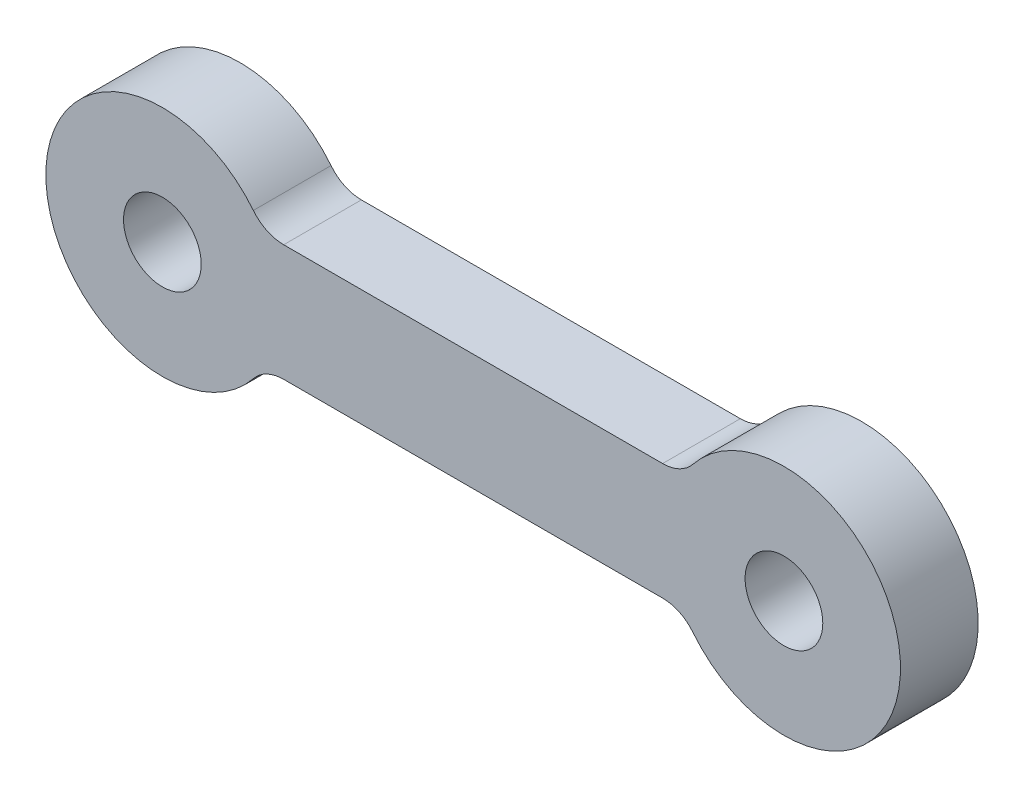
ISO-10303-21;
HEADER;
FILE_DESCRIPTION(('STEP AP214'),'2;1');
FILE_NAME('part.step','',(''),(''),'','','');
FILE_SCHEMA(('AUTOMOTIVE_DESIGN { 1 0 10303 214 1 1 1 1 }'));
ENDSEC;
DATA;
#1=APPLICATION_CONTEXT('core data for automotive mechanical design processes');
#2=APPLICATION_PROTOCOL_DEFINITION('international standard','automotive_design',2000,#1);
#3=PRODUCT_CONTEXT('',#1,'mechanical');
#4=PRODUCT('Part','Part','',(#3));
#5=PRODUCT_RELATED_PRODUCT_CATEGORY('part','',(#4));
#6=PRODUCT_DEFINITION_FORMATION('','',#4);
#7=PRODUCT_DEFINITION_CONTEXT('part definition',#1,'design');
#8=PRODUCT_DEFINITION('design','',#6,#7);
#9=PRODUCT_DEFINITION_SHAPE('','',#8);
#10=(LENGTH_UNIT() NAMED_UNIT(*) SI_UNIT(.MILLI.,.METRE.));
#11=(NAMED_UNIT(*) PLANE_ANGLE_UNIT() SI_UNIT($,.RADIAN.));
#12=(NAMED_UNIT(*) SI_UNIT($,.STERADIAN.) SOLID_ANGLE_UNIT());
#13=UNCERTAINTY_MEASURE_WITH_UNIT(LENGTH_MEASURE(1.E-05),#10,'distance_accuracy_value','');
#14=(GEOMETRIC_REPRESENTATION_CONTEXT(3) GLOBAL_UNCERTAINTY_ASSIGNED_CONTEXT((#13)) GLOBAL_UNIT_ASSIGNED_CONTEXT((#10,
#11,#12)) REPRESENTATION_CONTEXT('',''));
#15=CARTESIAN_POINT('',(0.,0.,0.));
#16=DIRECTION('',(0.,0.,1.));
#17=DIRECTION('',(1.,0.,0.));
#18=AXIS2_PLACEMENT_3D('',#15,#16,#17);
#19=CARTESIAN_POINT('',(-101.6,0.,12.7));
#20=DIRECTION('',(0.,0.,1.));
#21=DIRECTION('',(1.,0.,0.));
#22=AXIS2_PLACEMENT_3D('',#19,#20,#21);
#23=PLANE('',#22);
#24=CARTESIAN_POINT('',(0.,0.,12.7));
#25=DIRECTION('',(0.,0.,1.));
#26=DIRECTION('',(1.,0.,0.));
#27=AXIS2_PLACEMENT_3D('',#24,#25,#26);
#28=CIRCLE('',#27,6.35);
#29=CARTESIAN_POINT('',(6.35,0.,12.7));
#30=VERTEX_POINT('',#29);
#31=EDGE_CURVE('E183',#30,#30,#28,.T.);
#32=ORIENTED_EDGE('',*,*,#31,.F.);
#33=EDGE_LOOP('',(#32));
#34=FACE_BOUND('',#33,.T.);
#35=DIRECTION('',(-1.,0.,0.));
#36=VECTOR('',#35,1.);
#37=CARTESIAN_POINT('',(-85.1022160579064,9.525,12.7));
#38=LINE('',#37,#36);
#39=CARTESIAN_POINT('',(-19.8278686449149,9.525,12.7));
#40=VERTEX_POINT('',#39);
#41=CARTESIAN_POINT('',(-81.7721313550851,9.525,12.7));
#42=VERTEX_POINT('',#41);
#43=EDGE_CURVE('E142',#40,#42,#38,.T.);
#44=ORIENTED_EDGE('',*,*,#43,.T.);
#45=CARTESIAN_POINT('',(-81.7721313550851,15.875,12.7));
#46=DIRECTION('',(0.,0.,1.));
#47=DIRECTION('',(1.,0.,0.));
#48=AXIS2_PLACEMENT_3D('',#45,#46,#47);
#49=CIRCLE('',#48,6.35);
#50=CARTESIAN_POINT('',(-86.7290985163138,11.90625,12.7));
#51=VERTEX_POINT('',#50);
#52=EDGE_CURVE('E11',#42,#51,#49,.F.);
#53=ORIENTED_EDGE('',*,*,#52,.T.);
#54=CARTESIAN_POINT('',(-101.6,0.,12.7));
#55=DIRECTION('',(0.,0.,1.));
#56=DIRECTION('',(1.,0.,0.));
#57=AXIS2_PLACEMENT_3D('',#54,#55,#56);
#58=CIRCLE('',#57,19.05);
#59=CARTESIAN_POINT('',(-86.7290985163138,-11.90625,12.7));
#60=VERTEX_POINT('',#59);
#61=EDGE_CURVE('E136',#51,#60,#58,.T.);
#62=ORIENTED_EDGE('',*,*,#61,.T.);
#63=CARTESIAN_POINT('',(-81.7721313550851,-15.875,12.7));
#64=DIRECTION('',(0.,0.,1.));
#65=DIRECTION('',(1.,0.,0.));
#66=AXIS2_PLACEMENT_3D('',#63,#64,#65);
#67=CIRCLE('',#66,6.35);
#68=CARTESIAN_POINT('',(-81.7721313550851,-9.525,12.7));
#69=VERTEX_POINT('',#68);
#70=EDGE_CURVE('E158',#60,#69,#67,.F.);
#71=ORIENTED_EDGE('',*,*,#70,.T.);
#72=DIRECTION('',(1.,0.,0.));
#73=VECTOR('',#72,1.);
#74=CARTESIAN_POINT('',(-85.1022160579064,-9.525,12.7));
#75=LINE('',#74,#73);
#76=CARTESIAN_POINT('',(-19.8278686449149,-9.525,12.7));
#77=VERTEX_POINT('',#76);
#78=EDGE_CURVE('E174',#69,#77,#75,.T.);
#79=ORIENTED_EDGE('',*,*,#78,.T.);
#80=CARTESIAN_POINT('',(-19.8278686449149,-15.875,12.7));
#81=DIRECTION('',(0.,0.,1.));
#82=DIRECTION('',(1.,0.,0.));
#83=AXIS2_PLACEMENT_3D('',#80,#81,#82);
#84=CIRCLE('',#83,6.35);
#85=CARTESIAN_POINT('',(-14.8709014836862,-11.90625,12.7));
#86=VERTEX_POINT('',#85);
#87=EDGE_CURVE('E115',#77,#86,#84,.F.);
#88=ORIENTED_EDGE('',*,*,#87,.T.);
#89=CARTESIAN_POINT('',(0.,0.,12.7));
#90=DIRECTION('',(0.,0.,1.));
#91=DIRECTION('',(1.,0.,0.));
#92=AXIS2_PLACEMENT_3D('',#89,#90,#91);
#93=CIRCLE('',#92,19.05);
#94=CARTESIAN_POINT('',(-14.8709014836862,11.90625,12.7));
#95=VERTEX_POINT('',#94);
#96=EDGE_CURVE('E124',#86,#95,#93,.T.);
#97=ORIENTED_EDGE('',*,*,#96,.T.);
#98=CARTESIAN_POINT('',(-19.8278686449149,15.875,12.7));
#99=DIRECTION('',(0.,0.,1.));
#100=DIRECTION('',(1.,0.,0.));
#101=AXIS2_PLACEMENT_3D('',#98,#99,#100);
#102=CIRCLE('',#101,6.35);
#103=EDGE_CURVE('E61',#95,#40,#102,.F.);
#104=ORIENTED_EDGE('',*,*,#103,.T.);
#105=EDGE_LOOP('',(#44,#53,#62,#71,#79,#88,#97,#104));
#106=FACE_BOUND('',#105,.T.);
#107=CARTESIAN_POINT('',(-101.6,0.,12.7));
#108=DIRECTION('',(0.,0.,1.));
#109=DIRECTION('',(1.,0.,0.));
#110=AXIS2_PLACEMENT_3D('',#107,#108,#109);
#111=CIRCLE('',#110,6.35);
#112=CARTESIAN_POINT('',(-95.25,0.,12.7));
#113=VERTEX_POINT('',#112);
#114=EDGE_CURVE('E188',#113,#113,#111,.T.);
#115=ORIENTED_EDGE('',*,*,#114,.F.);
#116=EDGE_LOOP('',(#115));
#117=FACE_BOUND('',#116,.T.);
#118=ADVANCED_FACE('F39',(#34,#106,#117),#23,.T.);
#119=CARTESIAN_POINT('',(-101.6,0.,0.));
#120=DIRECTION('',(0.,0.,1.));
#121=DIRECTION('',(1.,0.,0.));
#122=AXIS2_PLACEMENT_3D('',#119,#120,#121);
#123=PLANE('',#122);
#124=CARTESIAN_POINT('',(-101.6,0.,0.));
#125=DIRECTION('',(0.,0.,1.));
#126=DIRECTION('',(1.,0.,0.));
#127=AXIS2_PLACEMENT_3D('',#124,#125,#126);
#128=CIRCLE('',#127,19.05);
#129=CARTESIAN_POINT('',(-86.7290985163138,11.90625,0.));
#130=VERTEX_POINT('',#129);
#131=CARTESIAN_POINT('',(-86.7290985163138,-11.90625,0.));
#132=VERTEX_POINT('',#131);
#133=EDGE_CURVE('E138',#130,#132,#128,.T.);
#134=ORIENTED_EDGE('',*,*,#133,.F.);
#135=CARTESIAN_POINT('',(-81.7721313550851,15.875,0.));
#136=DIRECTION('',(0.,0.,1.));
#137=DIRECTION('',(1.,0.,0.));
#138=AXIS2_PLACEMENT_3D('',#135,#136,#137);
#139=CIRCLE('',#138,6.35);
#140=CARTESIAN_POINT('',(-81.7721313550851,9.525,0.));
#141=VERTEX_POINT('',#140);
#142=EDGE_CURVE('E47',#130,#141,#139,.T.);
#143=ORIENTED_EDGE('',*,*,#142,.T.);
#144=DIRECTION('',(-1.,0.,0.));
#145=VECTOR('',#144,1.);
#146=CARTESIAN_POINT('',(-85.1022160579064,9.525,0.));
#147=LINE('',#146,#145);
#148=CARTESIAN_POINT('',(-19.8278686449149,9.525,0.));
#149=VERTEX_POINT('',#148);
#150=EDGE_CURVE('E133',#149,#141,#147,.T.);
#151=ORIENTED_EDGE('',*,*,#150,.F.);
#152=CARTESIAN_POINT('',(-19.8278686449149,15.875,0.));
#153=DIRECTION('',(0.,0.,1.));
#154=DIRECTION('',(1.,0.,0.));
#155=AXIS2_PLACEMENT_3D('',#152,#153,#154);
#156=CIRCLE('',#155,6.35);
#157=CARTESIAN_POINT('',(-14.8709014836862,11.90625,0.));
#158=VERTEX_POINT('',#157);
#159=EDGE_CURVE('E132',#149,#158,#156,.T.);
#160=ORIENTED_EDGE('',*,*,#159,.T.);
#161=CARTESIAN_POINT('',(0.,0.,0.));
#162=DIRECTION('',(0.,0.,1.));
#163=DIRECTION('',(1.,0.,0.));
#164=AXIS2_PLACEMENT_3D('',#161,#162,#163);
#165=CIRCLE('',#164,19.05);
#166=CARTESIAN_POINT('',(-14.8709014836862,-11.90625,0.));
#167=VERTEX_POINT('',#166);
#168=EDGE_CURVE('E122',#167,#158,#165,.T.);
#169=ORIENTED_EDGE('',*,*,#168,.F.);
#170=CARTESIAN_POINT('',(-19.8278686449149,-15.875,0.));
#171=DIRECTION('',(0.,0.,1.));
#172=DIRECTION('',(1.,0.,0.));
#173=AXIS2_PLACEMENT_3D('',#170,#171,#172);
#174=CIRCLE('',#173,6.35);
#175=CARTESIAN_POINT('',(-19.8278686449149,-9.525,0.));
#176=VERTEX_POINT('',#175);
#177=EDGE_CURVE('E105',#167,#176,#174,.T.);
#178=ORIENTED_EDGE('',*,*,#177,.T.);
#179=DIRECTION('',(1.,0.,0.));
#180=VECTOR('',#179,1.);
#181=CARTESIAN_POINT('',(-85.1022160579064,-9.525,0.));
#182=LINE('',#181,#180);
#183=CARTESIAN_POINT('',(-81.7721313550851,-9.525,0.));
#184=VERTEX_POINT('',#183);
#185=EDGE_CURVE('E134',#184,#176,#182,.T.);
#186=ORIENTED_EDGE('',*,*,#185,.F.);
#187=CARTESIAN_POINT('',(-81.7721313550851,-15.875,0.));
#188=DIRECTION('',(0.,0.,1.));
#189=DIRECTION('',(1.,0.,0.));
#190=AXIS2_PLACEMENT_3D('',#187,#188,#189);
#191=CIRCLE('',#190,6.35);
#192=EDGE_CURVE('E156',#184,#132,#191,.T.);
#193=ORIENTED_EDGE('',*,*,#192,.T.);
#194=EDGE_LOOP('',(#134,#143,#151,#160,#169,#178,#186,#193));
#195=FACE_BOUND('',#194,.T.);
#196=CARTESIAN_POINT('',(0.,0.,0.));
#197=DIRECTION('',(0.,0.,1.));
#198=DIRECTION('',(1.,0.,0.));
#199=AXIS2_PLACEMENT_3D('',#196,#197,#198);
#200=CIRCLE('',#199,6.35);
#201=CARTESIAN_POINT('',(6.35,0.,0.));
#202=VERTEX_POINT('',#201);
#203=EDGE_CURVE('E179',#202,#202,#200,.T.);
#204=ORIENTED_EDGE('',*,*,#203,.T.);
#205=EDGE_LOOP('',(#204));
#206=FACE_BOUND('',#205,.T.);
#207=CARTESIAN_POINT('',(-101.6,0.,0.));
#208=DIRECTION('',(0.,0.,1.));
#209=DIRECTION('',(1.,0.,0.));
#210=AXIS2_PLACEMENT_3D('',#207,#208,#209);
#211=CIRCLE('',#210,6.35);
#212=CARTESIAN_POINT('',(-95.25,0.,0.));
#213=VERTEX_POINT('',#212);
#214=EDGE_CURVE('E190',#213,#213,#211,.T.);
#215=ORIENTED_EDGE('',*,*,#214,.T.);
#216=EDGE_LOOP('',(#215));
#217=FACE_BOUND('',#216,.T.);
#218=ADVANCED_FACE('F129',(#195,#206,#217),#123,.F.);
#219=CARTESIAN_POINT('',(-101.6,0.,12.7));
#220=DIRECTION('',(0.,0.,-1.));
#221=DIRECTION('',(-1.,0.,0.));
#222=AXIS2_PLACEMENT_3D('',#219,#220,#221);
#223=CYLINDRICAL_SURFACE('',#222,19.05);
#224=ORIENTED_EDGE('',*,*,#133,.T.);
#225=DIRECTION('',(0.,0.,-1.));
#226=VECTOR('',#225,1.);
#227=CARTESIAN_POINT('',(-86.7290985163138,-11.90625,12.7));
#228=LINE('',#227,#226);
#229=EDGE_CURVE('E150',#132,#60,#228,.F.);
#230=ORIENTED_EDGE('',*,*,#229,.T.);
#231=ORIENTED_EDGE('',*,*,#61,.F.);
#232=DIRECTION('',(0.,0.,-1.));
#233=VECTOR('',#232,1.);
#234=CARTESIAN_POINT('',(-86.7290985163138,11.90625,12.7));
#235=LINE('',#234,#233);
#236=EDGE_CURVE('E147',#51,#130,#235,.T.);
#237=ORIENTED_EDGE('',*,*,#236,.T.);
#238=EDGE_LOOP('',(#224,#230,#231,#237));
#239=FACE_BOUND('',#238,.T.);
#240=ADVANCED_FACE('F172',(#239),#223,.T.);
#241=CARTESIAN_POINT('',(-85.1022160579064,-9.525,12.7));
#242=DIRECTION('',(0.,1.,0.));
#243=DIRECTION('',(0.,0.,1.));
#244=AXIS2_PLACEMENT_3D('',#241,#242,#243);
#245=PLANE('',#244);
#246=ORIENTED_EDGE('',*,*,#185,.T.);
#247=DIRECTION('',(0.,0.,1.));
#248=VECTOR('',#247,1.);
#249=CARTESIAN_POINT('',(-19.8278686449149,-9.525,12.7));
#250=LINE('',#249,#248);
#251=EDGE_CURVE('E110',#176,#77,#250,.T.);
#252=ORIENTED_EDGE('',*,*,#251,.T.);
#253=ORIENTED_EDGE('',*,*,#78,.F.);
#254=DIRECTION('',(0.,0.,1.));
#255=VECTOR('',#254,1.);
#256=CARTESIAN_POINT('',(-81.7721313550851,-9.525,0.));
#257=LINE('',#256,#255);
#258=EDGE_CURVE('E125',#69,#184,#257,.F.);
#259=ORIENTED_EDGE('',*,*,#258,.T.);
#260=EDGE_LOOP('',(#246,#252,#253,#259));
#261=FACE_BOUND('',#260,.T.);
#262=ADVANCED_FACE('F214',(#261),#245,.F.);
#263=CARTESIAN_POINT('',(0.,0.,12.7));
#264=DIRECTION('',(0.,0.,-1.));
#265=DIRECTION('',(-1.,0.,0.));
#266=AXIS2_PLACEMENT_3D('',#263,#264,#265);
#267=CYLINDRICAL_SURFACE('',#266,19.05);
#268=ORIENTED_EDGE('',*,*,#96,.F.);
#269=DIRECTION('',(0.,0.,-1.));
#270=VECTOR('',#269,1.);
#271=CARTESIAN_POINT('',(-14.8709014836862,-11.90625,12.7));
#272=LINE('',#271,#270);
#273=EDGE_CURVE('E109',#86,#167,#272,.T.);
#274=ORIENTED_EDGE('',*,*,#273,.T.);
#275=ORIENTED_EDGE('',*,*,#168,.T.);
#276=DIRECTION('',(0.,0.,-1.));
#277=VECTOR('',#276,1.);
#278=CARTESIAN_POINT('',(-14.8709014836862,11.90625,12.7));
#279=LINE('',#278,#277);
#280=EDGE_CURVE('E126',#158,#95,#279,.F.);
#281=ORIENTED_EDGE('',*,*,#280,.T.);
#282=EDGE_LOOP('',(#268,#274,#275,#281));
#283=FACE_BOUND('',#282,.T.);
#284=ADVANCED_FACE('F121',(#283),#267,.T.);
#285=CARTESIAN_POINT('',(-85.1022160579064,9.525,12.7));
#286=DIRECTION('',(0.,-1.,0.));
#287=DIRECTION('',(0.,0.,-1.));
#288=AXIS2_PLACEMENT_3D('',#285,#286,#287);
#289=PLANE('',#288);
#290=ORIENTED_EDGE('',*,*,#43,.F.);
#291=DIRECTION('',(0.,0.,1.));
#292=VECTOR('',#291,1.);
#293=CARTESIAN_POINT('',(-19.8278686449149,9.525,0.));
#294=LINE('',#293,#292);
#295=EDGE_CURVE('E116',#40,#149,#294,.F.);
#296=ORIENTED_EDGE('',*,*,#295,.T.);
#297=ORIENTED_EDGE('',*,*,#150,.T.);
#298=DIRECTION('',(0.,0.,1.));
#299=VECTOR('',#298,1.);
#300=CARTESIAN_POINT('',(-81.7721313550851,9.525,12.7));
#301=LINE('',#300,#299);
#302=EDGE_CURVE('E54',#141,#42,#301,.T.);
#303=ORIENTED_EDGE('',*,*,#302,.T.);
#304=EDGE_LOOP('',(#290,#296,#297,#303));
#305=FACE_BOUND('',#304,.T.);
#306=ADVANCED_FACE('F164',(#305),#289,.F.);
#307=CARTESIAN_POINT('',(0.,0.,12.7));
#308=DIRECTION('',(0.,0.,-1.));
#309=DIRECTION('',(-1.,0.,0.));
#310=AXIS2_PLACEMENT_3D('',#307,#308,#309);
#311=CYLINDRICAL_SURFACE('',#310,6.35);
#312=ORIENTED_EDGE('',*,*,#31,.T.);
#313=EDGE_LOOP('',(#312));
#314=FACE_BOUND('',#313,.T.);
#315=ORIENTED_EDGE('',*,*,#203,.F.);
#316=EDGE_LOOP('',(#315));
#317=FACE_BOUND('',#316,.T.);
#318=ADVANCED_FACE('F207',(#314,#317),#311,.F.);
#319=CARTESIAN_POINT('',(-101.6,0.,12.7));
#320=DIRECTION('',(0.,0.,-1.));
#321=DIRECTION('',(-1.,0.,0.));
#322=AXIS2_PLACEMENT_3D('',#319,#320,#321);
#323=CYLINDRICAL_SURFACE('',#322,6.35);
#324=ORIENTED_EDGE('',*,*,#114,.T.);
#325=EDGE_LOOP('',(#324));
#326=FACE_BOUND('',#325,.T.);
#327=ORIENTED_EDGE('',*,*,#214,.F.);
#328=EDGE_LOOP('',(#327));
#329=FACE_BOUND('',#328,.T.);
#330=ADVANCED_FACE('F196',(#326,#329),#323,.F.);
#331=CARTESIAN_POINT('',(-19.8278686449149,-15.875,12.7));
#332=DIRECTION('',(0.,0.,-1.));
#333=DIRECTION('',(-1.,0.,0.));
#334=AXIS2_PLACEMENT_3D('',#331,#332,#333);
#335=CYLINDRICAL_SURFACE('',#334,6.35);
#336=ORIENTED_EDGE('',*,*,#87,.F.);
#337=ORIENTED_EDGE('',*,*,#251,.F.);
#338=ORIENTED_EDGE('',*,*,#177,.F.);
#339=ORIENTED_EDGE('',*,*,#273,.F.);
#340=EDGE_LOOP('',(#336,#337,#338,#339));
#341=FACE_BOUND('',#340,.T.);
#342=ADVANCED_FACE('F108',(#341),#335,.F.);
#343=CARTESIAN_POINT('',(-81.7721313550851,-15.875,12.7));
#344=DIRECTION('',(0.,0.,-1.));
#345=DIRECTION('',(-1.,0.,0.));
#346=AXIS2_PLACEMENT_3D('',#343,#344,#345);
#347=CYLINDRICAL_SURFACE('',#346,6.35);
#348=ORIENTED_EDGE('',*,*,#70,.F.);
#349=ORIENTED_EDGE('',*,*,#229,.F.);
#350=ORIENTED_EDGE('',*,*,#192,.F.);
#351=ORIENTED_EDGE('',*,*,#258,.F.);
#352=EDGE_LOOP('',(#348,#349,#350,#351));
#353=FACE_BOUND('',#352,.T.);
#354=ADVANCED_FACE('F222',(#353),#347,.F.);
#355=CARTESIAN_POINT('',(-19.8278686449149,15.875,12.7));
#356=DIRECTION('',(0.,0.,-1.));
#357=DIRECTION('',(-1.,0.,0.));
#358=AXIS2_PLACEMENT_3D('',#355,#356,#357);
#359=CYLINDRICAL_SURFACE('',#358,6.35);
#360=ORIENTED_EDGE('',*,*,#103,.F.);
#361=ORIENTED_EDGE('',*,*,#280,.F.);
#362=ORIENTED_EDGE('',*,*,#159,.F.);
#363=ORIENTED_EDGE('',*,*,#295,.F.);
#364=EDGE_LOOP('',(#360,#361,#362,#363));
#365=FACE_BOUND('',#364,.T.);
#366=ADVANCED_FACE('F224',(#365),#359,.F.);
#367=CARTESIAN_POINT('',(-81.7721313550851,15.875,12.7));
#368=DIRECTION('',(0.,0.,-1.));
#369=DIRECTION('',(-1.,0.,0.));
#370=AXIS2_PLACEMENT_3D('',#367,#368,#369);
#371=CYLINDRICAL_SURFACE('',#370,6.35);
#372=ORIENTED_EDGE('',*,*,#52,.F.);
#373=ORIENTED_EDGE('',*,*,#302,.F.);
#374=ORIENTED_EDGE('',*,*,#142,.F.);
#375=ORIENTED_EDGE('',*,*,#236,.F.);
#376=EDGE_LOOP('',(#372,#373,#374,#375));
#377=FACE_BOUND('',#376,.T.);
#378=ADVANCED_FACE('F41',(#377),#371,.F.);
#379=CLOSED_SHELL('',(#118,#218,#240,#262,#284,#306,#318,#330,#342,#354,#366,#378));
#380=MANIFOLD_SOLID_BREP('B2',#379);
#381=ADVANCED_BREP_SHAPE_REPRESENTATION('',(#18,#380),#14);
#382=SHAPE_DEFINITION_REPRESENTATION(#9,#381);
ENDSEC;
END-ISO-10303-21;
